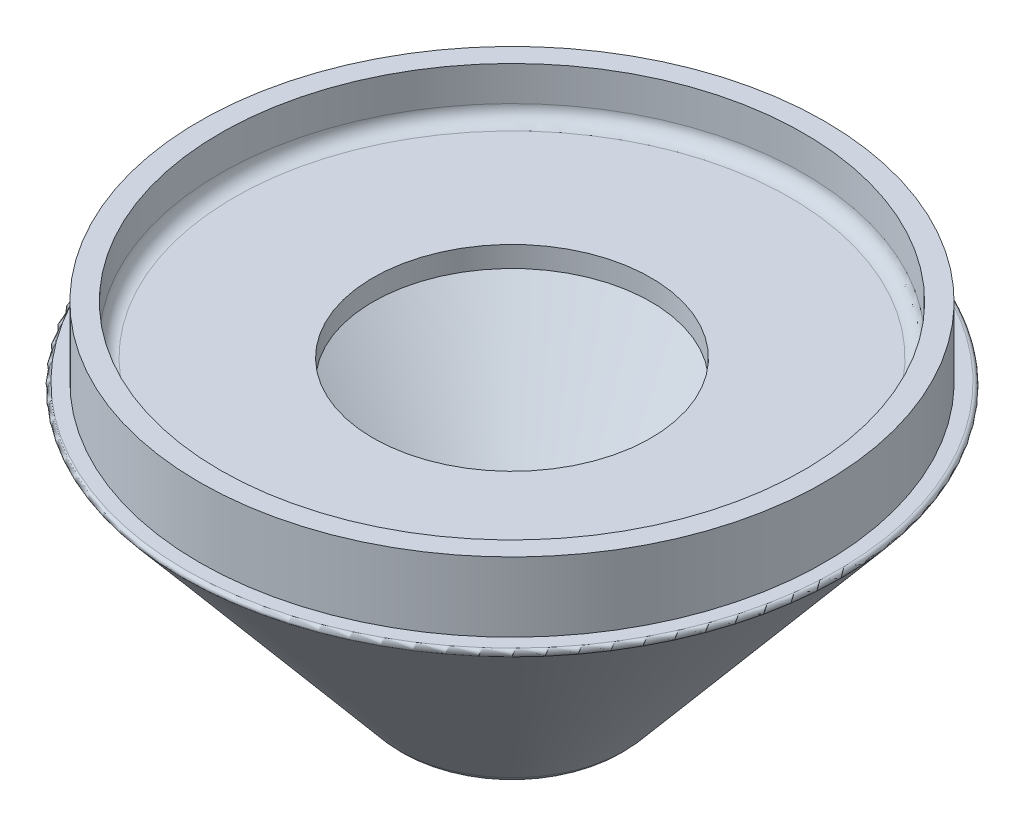
ISO-10303-21;
HEADER;
FILE_DESCRIPTION(('STEP AP214'),'2;1');
FILE_NAME('part.step','',(''),(''),'','','');
FILE_SCHEMA(('AUTOMOTIVE_DESIGN { 1 0 10303 214 1 1 1 1 }'));
ENDSEC;
DATA;
#1=APPLICATION_CONTEXT('core data for automotive mechanical design processes');
#2=APPLICATION_PROTOCOL_DEFINITION('international standard','automotive_design',2000,#1);
#3=PRODUCT_CONTEXT('',#1,'mechanical');
#4=PRODUCT('Part','Part','',(#3));
#5=PRODUCT_RELATED_PRODUCT_CATEGORY('part','',(#4));
#6=PRODUCT_DEFINITION_FORMATION('','',#4);
#7=PRODUCT_DEFINITION_CONTEXT('part definition',#1,'design');
#8=PRODUCT_DEFINITION('design','',#6,#7);
#9=PRODUCT_DEFINITION_SHAPE('','',#8);
#10=(LENGTH_UNIT() NAMED_UNIT(*) SI_UNIT(.MILLI.,.METRE.));
#11=(NAMED_UNIT(*) PLANE_ANGLE_UNIT() SI_UNIT($,.RADIAN.));
#12=(NAMED_UNIT(*) SI_UNIT($,.STERADIAN.) SOLID_ANGLE_UNIT());
#13=UNCERTAINTY_MEASURE_WITH_UNIT(LENGTH_MEASURE(1.E-05),#10,'distance_accuracy_value','');
#14=(GEOMETRIC_REPRESENTATION_CONTEXT(3) GLOBAL_UNCERTAINTY_ASSIGNED_CONTEXT((#13)) GLOBAL_UNIT_ASSIGNED_CONTEXT((#10,
#11,#12)) REPRESENTATION_CONTEXT('',''));
#15=CARTESIAN_POINT('',(0.,0.,0.));
#16=DIRECTION('',(0.,0.,1.));
#17=DIRECTION('',(1.,0.,0.));
#18=AXIS2_PLACEMENT_3D('',#15,#16,#17);
#19=CARTESIAN_POINT('',(0.,0.96418141452981,0.));
#20=DIRECTION('',(0.,1.,0.));
#21=DIRECTION('',(0.,0.,1.));
#22=AXIS2_PLACEMENT_3D('',#19,#20,#21);
#23=CONICAL_SURFACE('',#22,22.8509333353215,0.698131700797732);
#24=CARTESIAN_POINT('',(0.,-3.28557521937308,0.));
#25=DIRECTION('',(0.,1.,0.));
#26=DIRECTION('',(0.,0.,1.));
#27=AXIS2_PLACEMENT_3D('',#24,#25,#26);
#28=CIRCLE('',#27,19.2849641112204);
#29=CARTESIAN_POINT('',(0.,-3.28557521937308,19.2849641112204));
#30=VERTEX_POINT('',#29);
#31=EDGE_CURVE('E47',#30,#30,#28,.T.);
#32=ORIENTED_EDGE('',*,*,#31,.T.);
#33=EDGE_LOOP('',(#32));
#34=FACE_BOUND('',#33,.T.);
#35=CARTESIAN_POINT('',(0.,-18.5,0.));
#36=DIRECTION('',(0.,1.,0.));
#37=DIRECTION('',(0.,0.,1.));
#38=AXIS2_PLACEMENT_3D('',#35,#36,#37);
#39=CIRCLE('',#38,6.51854588922189);
#40=CARTESIAN_POINT('',(0.,-18.5,6.51854588922189));
#41=VERTEX_POINT('',#40);
#42=EDGE_CURVE('E64',#41,#41,#39,.T.);
#43=ORIENTED_EDGE('',*,*,#42,.F.);
#44=EDGE_LOOP('',(#43));
#45=FACE_BOUND('',#44,.T.);
#46=ADVANCED_FACE('F32',(#34,#45),#23,.F.);
#47=CARTESIAN_POINT('',(0.,-18.5,0.));
#48=DIRECTION('',(0.,1.,0.));
#49=DIRECTION('',(0.,0.,1.));
#50=AXIS2_PLACEMENT_3D('',#47,#48,#49);
#51=PLANE('',#50);
#52=CARTESIAN_POINT('',(0.,-18.5,0.));
#53=DIRECTION('',(0.,1.,0.));
#54=DIRECTION('',(0.,0.,1.));
#55=AXIS2_PLACEMENT_3D('',#52,#53,#54);
#56=CIRCLE('',#55,4.1);
#57=CARTESIAN_POINT('',(0.,-18.5,4.1));
#58=VERTEX_POINT('',#57);
#59=EDGE_CURVE('E72',#58,#58,#56,.T.);
#60=ORIENTED_EDGE('',*,*,#59,.F.);
#61=EDGE_LOOP('',(#60));
#62=FACE_BOUND('',#61,.T.);
#63=ORIENTED_EDGE('',*,*,#42,.T.);
#64=EDGE_LOOP('',(#63));
#65=FACE_BOUND('',#64,.T.);
#66=ADVANCED_FACE('F109',(#62,#65),#51,.T.);
#67=CARTESIAN_POINT('',(0.,5.,0.));
#68=DIRECTION('',(0.,1.,0.));
#69=DIRECTION('',(0.,0.,1.));
#70=AXIS2_PLACEMENT_3D('',#67,#68,#69);
#71=PLANE('',#70);
#72=CARTESIAN_POINT('',(0.,5.,0.));
#73=DIRECTION('',(0.,1.,0.));
#74=DIRECTION('',(0.,0.,1.));
#75=AXIS2_PLACEMENT_3D('',#72,#73,#74);
#76=CIRCLE('',#75,22.5);
#77=CARTESIAN_POINT('',(0.,5.,22.5));
#78=VERTEX_POINT('',#77);
#79=EDGE_CURVE('E67',#78,#78,#76,.T.);
#80=ORIENTED_EDGE('',*,*,#79,.T.);
#81=EDGE_LOOP('',(#80));
#82=FACE_BOUND('',#81,.T.);
#83=CARTESIAN_POINT('',(0.,5.,0.));
#84=DIRECTION('',(0.,1.,0.));
#85=DIRECTION('',(0.,0.,1.));
#86=AXIS2_PLACEMENT_3D('',#83,#84,#85);
#87=CIRCLE('',#86,21.);
#88=CARTESIAN_POINT('',(0.,5.,21.));
#89=VERTEX_POINT('',#88);
#90=EDGE_CURVE('E71',#89,#89,#87,.T.);
#91=ORIENTED_EDGE('',*,*,#90,.F.);
#92=EDGE_LOOP('',(#91));
#93=FACE_BOUND('',#92,.T.);
#94=ADVANCED_FACE('F115',(#82,#93),#71,.T.);
#95=CARTESIAN_POINT('',(0.,5.,0.));
#96=DIRECTION('',(0.,-1.,0.));
#97=DIRECTION('',(0.,0.,-1.));
#98=AXIS2_PLACEMENT_3D('',#95,#96,#97);
#99=CYLINDRICAL_SURFACE('',#98,22.5);
#100=ORIENTED_EDGE('',*,*,#79,.F.);
#101=EDGE_LOOP('',(#100));
#102=FACE_BOUND('',#101,.T.);
#103=CARTESIAN_POINT('',(0.,0.,0.));
#104=DIRECTION('',(0.,1.,0.));
#105=DIRECTION('',(0.,0.,1.));
#106=AXIS2_PLACEMENT_3D('',#103,#104,#105);
#107=CIRCLE('',#106,22.5);
#108=CARTESIAN_POINT('',(0.,0.,22.5));
#109=VERTEX_POINT('',#108);
#110=EDGE_CURVE('E68',#109,#109,#107,.T.);
#111=ORIENTED_EDGE('',*,*,#110,.T.);
#112=EDGE_LOOP('',(#111));
#113=FACE_BOUND('',#112,.T.);
#114=ADVANCED_FACE('F120',(#102,#113),#99,.T.);
#115=CARTESIAN_POINT('',(0.,5.,0.));
#116=DIRECTION('',(0.,-1.,0.));
#117=DIRECTION('',(0.,0.,-1.));
#118=AXIS2_PLACEMENT_3D('',#115,#116,#117);
#119=CYLINDRICAL_SURFACE('',#118,21.);
#120=CARTESIAN_POINT('',(0.,2.5,0.));
#121=DIRECTION('',(0.,1.,0.));
#122=DIRECTION('',(0.,0.,1.));
#123=AXIS2_PLACEMENT_3D('',#120,#121,#122);
#124=CIRCLE('',#123,21.);
#125=CARTESIAN_POINT('',(0.,2.5,21.));
#126=VERTEX_POINT('',#125);
#127=EDGE_CURVE('E52',#126,#126,#124,.F.);
#128=ORIENTED_EDGE('',*,*,#127,.T.);
#129=EDGE_LOOP('',(#128));
#130=FACE_BOUND('',#129,.T.);
#131=ORIENTED_EDGE('',*,*,#90,.T.);
#132=EDGE_LOOP('',(#131));
#133=FACE_BOUND('',#132,.T.);
#134=ADVANCED_FACE('F180',(#130,#133),#119,.F.);
#135=CARTESIAN_POINT('',(0.,0.,0.));
#136=DIRECTION('',(0.,1.,0.));
#137=DIRECTION('',(0.,0.,1.));
#138=AXIS2_PLACEMENT_3D('',#135,#136,#137);
#139=CONICAL_SURFACE('',#138,24.,0.698131700797732);
#140=CARTESIAN_POINT('',(0.,-0.410696902421636,0.));
#141=DIRECTION('',(0.,-1.,0.));
#142=DIRECTION('',(0.,0.,-1.));
#143=AXIS2_PLACEMENT_3D('',#140,#141,#142);
#144=CIRCLE('',#143,23.6553843806524);
#145=CARTESIAN_POINT('',(0.,-0.410696902421636,-23.6553843806524));
#146=VERTEX_POINT('',#145);
#147=EDGE_CURVE('E10',#146,#146,#144,.T.);
#148=ORIENTED_EDGE('',*,*,#147,.T.);
#149=EDGE_LOOP('',(#148));
#150=FACE_BOUND('',#149,.T.);
#151=CARTESIAN_POINT('',(0.,-18.9283628290596,0.));
#152=DIRECTION('',(0.,1.,0.));
#153=DIRECTION('',(0.,0.,1.));
#154=AXIS2_PLACEMENT_3D('',#151,#152,#153);
#155=CIRCLE('',#154,8.11721773134632);
#156=CARTESIAN_POINT('',(0.,-18.9283628290596,8.11721773134632));
#157=VERTEX_POINT('',#156);
#158=EDGE_CURVE('E61',#157,#157,#155,.T.);
#159=ORIENTED_EDGE('',*,*,#158,.T.);
#160=EDGE_LOOP('',(#159));
#161=FACE_BOUND('',#160,.T.);
#162=ADVANCED_FACE('F175',(#150,#161),#139,.T.);
#163=CARTESIAN_POINT('',(0.,-20.,0.));
#164=DIRECTION('',(0.,1.,0.));
#165=DIRECTION('',(0.,0.,1.));
#166=AXIS2_PLACEMENT_3D('',#163,#164,#165);
#167=PLANE('',#166);
#168=CARTESIAN_POINT('',(0.,-20.,0.));
#169=DIRECTION('',(0.,1.,0.));
#170=DIRECTION('',(0.,0.,1.));
#171=AXIS2_PLACEMENT_3D('',#168,#169,#170);
#172=CIRCLE('',#171,4.1);
#173=CARTESIAN_POINT('',(0.,-20.,4.1));
#174=VERTEX_POINT('',#173);
#175=EDGE_CURVE('E79',#174,#174,#172,.T.);
#176=ORIENTED_EDGE('',*,*,#175,.T.);
#177=EDGE_LOOP('',(#176));
#178=FACE_BOUND('',#177,.T.);
#179=CARTESIAN_POINT('',(0.,-20.,0.));
#180=DIRECTION('',(0.,1.,0.));
#181=DIRECTION('',(0.,0.,1.));
#182=AXIS2_PLACEMENT_3D('',#179,#180,#181);
#183=CIRCLE('',#182,5.81908440198939);
#184=CARTESIAN_POINT('',(0.,-20.,5.81908440198939));
#185=VERTEX_POINT('',#184);
#186=EDGE_CURVE('E58',#185,#185,#183,.F.);
#187=ORIENTED_EDGE('',*,*,#186,.T.);
#188=EDGE_LOOP('',(#187));
#189=FACE_BOUND('',#188,.T.);
#190=ADVANCED_FACE('F179',(#178,#189),#167,.F.);
#191=CARTESIAN_POINT('',(0.,0.,0.));
#192=DIRECTION('',(0.,1.,0.));
#193=DIRECTION('',(0.,0.,1.));
#194=AXIS2_PLACEMENT_3D('',#191,#192,#193);
#195=PLANE('',#194);
#196=CARTESIAN_POINT('',(0.,0.,0.));
#197=DIRECTION('',(0.,1.,0.));
#198=DIRECTION('',(0.,0.,1.));
#199=AXIS2_PLACEMENT_3D('',#196,#197,#198);
#200=CIRCLE('',#199,23.4638732698726);
#201=CARTESIAN_POINT('',(0.,0.,23.4638732698726));
#202=VERTEX_POINT('',#201);
#203=EDGE_CURVE('E39',#202,#202,#200,.T.);
#204=ORIENTED_EDGE('',*,*,#203,.T.);
#205=EDGE_LOOP('',(#204));
#206=FACE_BOUND('',#205,.T.);
#207=ORIENTED_EDGE('',*,*,#110,.F.);
#208=EDGE_LOOP('',(#207));
#209=FACE_BOUND('',#208,.T.);
#210=ADVANCED_FACE('F125',(#206,#209),#195,.T.);
#211=CARTESIAN_POINT('',(0.,-17.,0.));
#212=DIRECTION('',(0.,1.,0.));
#213=DIRECTION('',(0.,0.,1.));
#214=AXIS2_PLACEMENT_3D('',#211,#212,#213);
#215=TOROIDAL_SURFACE('',#214,5.81908440198939,3.);
#216=ORIENTED_EDGE('',*,*,#186,.F.);
#217=EDGE_LOOP('',(#216));
#218=FACE_BOUND('',#217,.T.);
#219=ORIENTED_EDGE('',*,*,#158,.F.);
#220=EDGE_LOOP('',(#219));
#221=FACE_BOUND('',#220,.T.);
#222=ADVANCED_FACE('F104',(#218,#221),#215,.T.);
#223=CARTESIAN_POINT('',(0.,-20.,0.));
#224=DIRECTION('',(0.,1.,0.));
#225=DIRECTION('',(0.,0.,1.));
#226=AXIS2_PLACEMENT_3D('',#223,#224,#225);
#227=CYLINDRICAL_SURFACE('',#226,4.1);
#228=ORIENTED_EDGE('',*,*,#59,.T.);
#229=EDGE_LOOP('',(#228));
#230=FACE_BOUND('',#229,.T.);
#231=ORIENTED_EDGE('',*,*,#175,.F.);
#232=EDGE_LOOP('',(#231));
#233=FACE_BOUND('',#232,.T.);
#234=ADVANCED_FACE('F95',(#230,#233),#227,.F.);
#235=CARTESIAN_POINT('',(0.,1.5,0.));
#236=DIRECTION('',(0.,1.,0.));
#237=DIRECTION('',(0.,0.,1.));
#238=AXIS2_PLACEMENT_3D('',#235,#236,#237);
#239=PLANE('',#238);
#240=CARTESIAN_POINT('',(0.,1.5,0.));
#241=DIRECTION('',(0.,1.,0.));
#242=DIRECTION('',(0.,0.,1.));
#243=AXIS2_PLACEMENT_3D('',#240,#241,#242);
#244=CIRCLE('',#243,20.);
#245=CARTESIAN_POINT('',(0.,1.5,20.));
#246=VERTEX_POINT('',#245);
#247=EDGE_CURVE('E55',#246,#246,#244,.T.);
#248=ORIENTED_EDGE('',*,*,#247,.T.);
#249=EDGE_LOOP('',(#248));
#250=FACE_BOUND('',#249,.T.);
#251=CARTESIAN_POINT('',(0.,1.5,0.));
#252=DIRECTION('',(0.,1.,0.));
#253=DIRECTION('',(0.,0.,1.));
#254=AXIS2_PLACEMENT_3D('',#251,#252,#253);
#255=CIRCLE('',#254,10.);
#256=CARTESIAN_POINT('',(0.,1.5,10.));
#257=VERTEX_POINT('',#256);
#258=EDGE_CURVE('E82',#257,#257,#255,.T.);
#259=ORIENTED_EDGE('',*,*,#258,.F.);
#260=EDGE_LOOP('',(#259));
#261=FACE_BOUND('',#260,.T.);
#262=ADVANCED_FACE('F92',(#250,#261),#239,.T.);
#263=CARTESIAN_POINT('',(0.,0.,0.));
#264=DIRECTION('',(0.,1.,0.));
#265=DIRECTION('',(0.,0.,1.));
#266=AXIS2_PLACEMENT_3D('',#263,#264,#265);
#267=PLANE('',#266);
#268=CARTESIAN_POINT('',(0.,0.,0.));
#269=DIRECTION('',(0.,1.,0.));
#270=DIRECTION('',(0.,0.,1.));
#271=AXIS2_PLACEMENT_3D('',#268,#269,#270);
#272=CIRCLE('',#271,17.7528752249825);
#273=CARTESIAN_POINT('',(0.,0.,17.7528752249825));
#274=VERTEX_POINT('',#273);
#275=EDGE_CURVE('E43',#274,#274,#272,.F.);
#276=ORIENTED_EDGE('',*,*,#275,.T.);
#277=EDGE_LOOP('',(#276));
#278=FACE_BOUND('',#277,.T.);
#279=CARTESIAN_POINT('',(0.,0.,0.));
#280=DIRECTION('',(0.,1.,0.));
#281=DIRECTION('',(0.,0.,1.));
#282=AXIS2_PLACEMENT_3D('',#279,#280,#281);
#283=CIRCLE('',#282,10.);
#284=CARTESIAN_POINT('',(0.,0.,10.));
#285=VERTEX_POINT('',#284);
#286=EDGE_CURVE('E83',#285,#285,#283,.T.);
#287=ORIENTED_EDGE('',*,*,#286,.T.);
#288=EDGE_LOOP('',(#287));
#289=FACE_BOUND('',#288,.T.);
#290=ADVANCED_FACE('F94',(#278,#289),#267,.F.);
#291=CARTESIAN_POINT('',(0.,1.5,0.));
#292=DIRECTION('',(0.,-1.,0.));
#293=DIRECTION('',(0.,0.,-1.));
#294=AXIS2_PLACEMENT_3D('',#291,#292,#293);
#295=CYLINDRICAL_SURFACE('',#294,10.);
#296=ORIENTED_EDGE('',*,*,#258,.T.);
#297=EDGE_LOOP('',(#296));
#298=FACE_BOUND('',#297,.T.);
#299=ORIENTED_EDGE('',*,*,#286,.F.);
#300=EDGE_LOOP('',(#299));
#301=FACE_BOUND('',#300,.T.);
#302=ADVANCED_FACE('F89',(#298,#301),#295,.F.);
#303=CARTESIAN_POINT('',(0.,2.5,0.));
#304=DIRECTION('',(0.,1.,0.));
#305=DIRECTION('',(0.,0.,1.));
#306=AXIS2_PLACEMENT_3D('',#303,#304,#305);
#307=TOROIDAL_SURFACE('',#306,20.,1.);
#308=ORIENTED_EDGE('',*,*,#127,.F.);
#309=EDGE_LOOP('',(#308));
#310=FACE_BOUND('',#309,.T.);
#311=ORIENTED_EDGE('',*,*,#247,.F.);
#312=EDGE_LOOP('',(#311));
#313=FACE_BOUND('',#312,.T.);
#314=ADVANCED_FACE('F127',(#310,#313),#307,.F.);
#315=CARTESIAN_POINT('',(0.,-2.,0.));
#316=DIRECTION('',(0.,1.,0.));
#317=DIRECTION('',(0.,0.,1.));
#318=AXIS2_PLACEMENT_3D('',#315,#316,#317);
#319=TOROIDAL_SURFACE('',#318,17.7528752249825,2.);
#320=ORIENTED_EDGE('',*,*,#275,.F.);
#321=EDGE_LOOP('',(#320));
#322=FACE_BOUND('',#321,.T.);
#323=ORIENTED_EDGE('',*,*,#31,.F.);
#324=EDGE_LOOP('',(#323));
#325=FACE_BOUND('',#324,.T.);
#326=ADVANCED_FACE('F129',(#322,#325),#319,.F.);
#327=CARTESIAN_POINT('',(0.,-0.25,0.));
#328=DIRECTION('',(0.,1.,0.));
#329=DIRECTION('',(0.,0.,1.));
#330=AXIS2_PLACEMENT_3D('',#327,#328,#329);
#331=TOROIDAL_SURFACE('',#330,23.4638732698726,0.25);
#332=ORIENTED_EDGE('',*,*,#147,.F.);
#333=EDGE_LOOP('',(#332));
#334=FACE_BOUND('',#333,.T.);
#335=ORIENTED_EDGE('',*,*,#203,.F.);
#336=EDGE_LOOP('',(#335));
#337=FACE_BOUND('',#336,.T.);
#338=ADVANCED_FACE('F34',(#334,#337),#331,.T.);
#339=CLOSED_SHELL('',(#46,#66,#94,#114,#134,#162,#190,#210,#222,#234,#262,#290,#302,#314,#326,#338));
#340=MANIFOLD_SOLID_BREP('B2',#339);
#341=ADVANCED_BREP_SHAPE_REPRESENTATION('',(#18,#340),#14);
#342=SHAPE_DEFINITION_REPRESENTATION(#9,#341);
ENDSEC;
END-ISO-10303-21;
